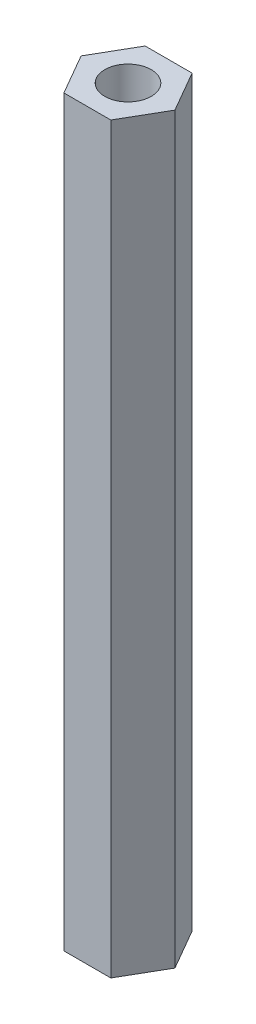
ISO-10303-21;
HEADER;
FILE_DESCRIPTION(('STEP AP214'),'2;1');
FILE_NAME('part.step','',(''),(''),'','','');
FILE_SCHEMA(('AUTOMOTIVE_DESIGN { 1 0 10303 214 1 1 1 1 }'));
ENDSEC;
DATA;
#1=APPLICATION_CONTEXT('core data for automotive mechanical design processes');
#2=APPLICATION_PROTOCOL_DEFINITION('international standard','automotive_design',2000,#1);
#3=PRODUCT_CONTEXT('',#1,'mechanical');
#4=PRODUCT('Part','Part','',(#3));
#5=PRODUCT_RELATED_PRODUCT_CATEGORY('part','',(#4));
#6=PRODUCT_DEFINITION_FORMATION('','',#4);
#7=PRODUCT_DEFINITION_CONTEXT('part definition',#1,'design');
#8=PRODUCT_DEFINITION('design','',#6,#7);
#9=PRODUCT_DEFINITION_SHAPE('','',#8);
#10=(LENGTH_UNIT() NAMED_UNIT(*) SI_UNIT(.MILLI.,.METRE.));
#11=(NAMED_UNIT(*) PLANE_ANGLE_UNIT() SI_UNIT($,.RADIAN.));
#12=(NAMED_UNIT(*) SI_UNIT($,.STERADIAN.) SOLID_ANGLE_UNIT());
#13=UNCERTAINTY_MEASURE_WITH_UNIT(LENGTH_MEASURE(1.E-05),#10,'distance_accuracy_value','');
#14=(GEOMETRIC_REPRESENTATION_CONTEXT(3) GLOBAL_UNCERTAINTY_ASSIGNED_CONTEXT((#13)) GLOBAL_UNIT_ASSIGNED_CONTEXT((#10,
#11,#12)) REPRESENTATION_CONTEXT('',''));
#15=CARTESIAN_POINT('',(0.,0.,0.));
#16=DIRECTION('',(0.,0.,1.));
#17=DIRECTION('',(1.,0.,0.));
#18=AXIS2_PLACEMENT_3D('',#15,#16,#17);
#19=CARTESIAN_POINT('',(0.,64.,0.));
#20=DIRECTION('',(0.,1.,0.));
#21=DIRECTION('',(0.,0.,1.));
#22=AXIS2_PLACEMENT_3D('',#19,#20,#21);
#23=PLANE('',#22);
#24=DIRECTION('',(-0.5,0.,-0.866025403784438));
#25=VECTOR('',#24,1.);
#26=CARTESIAN_POINT('',(4.04145188432738,64.,0.));
#27=LINE('',#26,#25);
#28=CARTESIAN_POINT('',(4.04145188432738,64.,0.));
#29=VERTEX_POINT('',#28);
#30=CARTESIAN_POINT('',(2.02072594216369,64.,-3.5));
#31=VERTEX_POINT('',#30);
#32=EDGE_CURVE('E139',#29,#31,#27,.T.);
#33=ORIENTED_EDGE('',*,*,#32,.T.);
#34=DIRECTION('',(-1.,0.,0.));
#35=VECTOR('',#34,1.);
#36=CARTESIAN_POINT('',(2.02072594216369,64.,-3.5));
#37=LINE('',#36,#35);
#38=CARTESIAN_POINT('',(-2.02072594216369,64.,-3.5));
#39=VERTEX_POINT('',#38);
#40=EDGE_CURVE('E97',#31,#39,#37,.T.);
#41=ORIENTED_EDGE('',*,*,#40,.T.);
#42=DIRECTION('',(-0.5,0.,0.866025403784439));
#43=VECTOR('',#42,1.);
#44=CARTESIAN_POINT('',(-2.02072594216369,64.,-3.5));
#45=LINE('',#44,#43);
#46=CARTESIAN_POINT('',(-4.04145188432738,64.,0.));
#47=VERTEX_POINT('',#46);
#48=EDGE_CURVE('E110',#39,#47,#45,.T.);
#49=ORIENTED_EDGE('',*,*,#48,.T.);
#50=DIRECTION('',(0.5,0.,0.866025403784438));
#51=VECTOR('',#50,1.);
#52=CARTESIAN_POINT('',(-4.04145188432738,64.,0.));
#53=LINE('',#52,#51);
#54=CARTESIAN_POINT('',(-2.02072594216369,64.,3.5));
#55=VERTEX_POINT('',#54);
#56=EDGE_CURVE('E104',#47,#55,#53,.T.);
#57=ORIENTED_EDGE('',*,*,#56,.T.);
#58=DIRECTION('',(1.,0.,0.));
#59=VECTOR('',#58,1.);
#60=CARTESIAN_POINT('',(-2.02072594216369,64.,3.5));
#61=LINE('',#60,#59);
#62=CARTESIAN_POINT('',(2.02072594216369,64.,3.5));
#63=VERTEX_POINT('',#62);
#64=EDGE_CURVE('E108',#55,#63,#61,.T.);
#65=ORIENTED_EDGE('',*,*,#64,.T.);
#66=DIRECTION('',(0.5,0.,-0.866025403784439));
#67=VECTOR('',#66,1.);
#68=CARTESIAN_POINT('',(2.02072594216369,64.,3.5));
#69=LINE('',#68,#67);
#70=EDGE_CURVE('E60',#63,#29,#69,.T.);
#71=ORIENTED_EDGE('',*,*,#70,.T.);
#72=EDGE_LOOP('',(#33,#41,#49,#57,#65,#71));
#73=FACE_BOUND('',#72,.T.);
#74=CARTESIAN_POINT('',(0.,64.,0.));
#75=DIRECTION('',(0.,1.,0.));
#76=DIRECTION('',(0.,0.,1.));
#77=AXIS2_PLACEMENT_3D('',#74,#75,#76);
#78=CIRCLE('',#77,2.);
#79=CARTESIAN_POINT('',(0.,64.,2.));
#80=VERTEX_POINT('',#79);
#81=EDGE_CURVE('E132',#80,#80,#78,.T.);
#82=ORIENTED_EDGE('',*,*,#81,.F.);
#83=EDGE_LOOP('',(#82));
#84=FACE_BOUND('',#83,.T.);
#85=ADVANCED_FACE('F43',(#73,#84),#23,.T.);
#86=CARTESIAN_POINT('',(0.,0.,0.));
#87=DIRECTION('',(0.,1.,0.));
#88=DIRECTION('',(0.,0.,1.));
#89=AXIS2_PLACEMENT_3D('',#86,#87,#88);
#90=PLANE('',#89);
#91=DIRECTION('',(-0.5,0.,-0.866025403784438));
#92=VECTOR('',#91,1.);
#93=CARTESIAN_POINT('',(4.04145188432738,0.,0.));
#94=LINE('',#93,#92);
#95=CARTESIAN_POINT('',(4.04145188432738,0.,0.));
#96=VERTEX_POINT('',#95);
#97=CARTESIAN_POINT('',(2.02072594216369,0.,-3.5));
#98=VERTEX_POINT('',#97);
#99=EDGE_CURVE('E128',#96,#98,#94,.T.);
#100=ORIENTED_EDGE('',*,*,#99,.F.);
#101=DIRECTION('',(0.5,0.,-0.866025403784439));
#102=VECTOR('',#101,1.);
#103=CARTESIAN_POINT('',(2.02072594216369,0.,3.5));
#104=LINE('',#103,#102);
#105=CARTESIAN_POINT('',(2.02072594216369,0.,3.5));
#106=VERTEX_POINT('',#105);
#107=EDGE_CURVE('E89',#106,#96,#104,.T.);
#108=ORIENTED_EDGE('',*,*,#107,.F.);
#109=DIRECTION('',(1.,0.,0.));
#110=VECTOR('',#109,1.);
#111=CARTESIAN_POINT('',(-2.02072594216369,0.,3.5));
#112=LINE('',#111,#110);
#113=CARTESIAN_POINT('',(-2.02072594216369,0.,3.5));
#114=VERTEX_POINT('',#113);
#115=EDGE_CURVE('E83',#114,#106,#112,.T.);
#116=ORIENTED_EDGE('',*,*,#115,.F.);
#117=DIRECTION('',(0.5,0.,0.866025403784438));
#118=VECTOR('',#117,1.);
#119=CARTESIAN_POINT('',(-4.04145188432738,0.,0.));
#120=LINE('',#119,#118);
#121=CARTESIAN_POINT('',(-4.04145188432738,0.,0.));
#122=VERTEX_POINT('',#121);
#123=EDGE_CURVE('E118',#122,#114,#120,.T.);
#124=ORIENTED_EDGE('',*,*,#123,.F.);
#125=DIRECTION('',(-0.5,0.,0.866025403784439));
#126=VECTOR('',#125,1.);
#127=CARTESIAN_POINT('',(-2.02072594216369,0.,-3.5));
#128=LINE('',#127,#126);
#129=CARTESIAN_POINT('',(-2.02072594216369,0.,-3.5));
#130=VERTEX_POINT('',#129);
#131=EDGE_CURVE('E134',#130,#122,#128,.T.);
#132=ORIENTED_EDGE('',*,*,#131,.F.);
#133=DIRECTION('',(-1.,0.,0.));
#134=VECTOR('',#133,1.);
#135=CARTESIAN_POINT('',(2.02072594216369,0.,-3.5));
#136=LINE('',#135,#134);
#137=EDGE_CURVE('E131',#98,#130,#136,.T.);
#138=ORIENTED_EDGE('',*,*,#137,.F.);
#139=EDGE_LOOP('',(#100,#108,#116,#124,#132,#138));
#140=FACE_BOUND('',#139,.T.);
#141=CARTESIAN_POINT('',(0.,0.,0.));
#142=DIRECTION('',(0.,1.,0.));
#143=DIRECTION('',(0.,0.,1.));
#144=AXIS2_PLACEMENT_3D('',#141,#142,#143);
#145=CIRCLE('',#144,2.);
#146=CARTESIAN_POINT('',(0.,0.,2.));
#147=VERTEX_POINT('',#146);
#148=EDGE_CURVE('E240',#147,#147,#145,.T.);
#149=ORIENTED_EDGE('',*,*,#148,.T.);
#150=EDGE_LOOP('',(#149));
#151=FACE_BOUND('',#150,.T.);
#152=ADVANCED_FACE('F148',(#140,#151),#90,.F.);
#153=CARTESIAN_POINT('',(4.04145188432738,64.,0.));
#154=DIRECTION('',(-0.866025403784439,0.,0.5));
#155=DIRECTION('',(0.5,0.,0.866025403784439));
#156=AXIS2_PLACEMENT_3D('',#153,#154,#155);
#157=PLANE('',#156);
#158=ORIENTED_EDGE('',*,*,#99,.T.);
#159=DIRECTION('',(0.,-1.,0.));
#160=VECTOR('',#159,1.);
#161=CARTESIAN_POINT('',(2.02072594216369,64.,-3.5));
#162=LINE('',#161,#160);
#163=EDGE_CURVE('E11',#31,#98,#162,.T.);
#164=ORIENTED_EDGE('',*,*,#163,.F.);
#165=ORIENTED_EDGE('',*,*,#32,.F.);
#166=DIRECTION('',(0.,-1.,0.));
#167=VECTOR('',#166,1.);
#168=CARTESIAN_POINT('',(4.04145188432738,64.,0.));
#169=LINE('',#168,#167);
#170=EDGE_CURVE('E124',#29,#96,#169,.T.);
#171=ORIENTED_EDGE('',*,*,#170,.T.);
#172=EDGE_LOOP('',(#158,#164,#165,#171));
#173=FACE_BOUND('',#172,.T.);
#174=ADVANCED_FACE('F45',(#173),#157,.F.);
#175=CARTESIAN_POINT('',(2.02072594216369,64.,-3.5));
#176=DIRECTION('',(0.,0.,1.));
#177=DIRECTION('',(1.,0.,0.));
#178=AXIS2_PLACEMENT_3D('',#175,#176,#177);
#179=PLANE('',#178);
#180=ORIENTED_EDGE('',*,*,#137,.T.);
#181=DIRECTION('',(0.,-1.,0.));
#182=VECTOR('',#181,1.);
#183=CARTESIAN_POINT('',(-2.02072594216369,64.,-3.5));
#184=LINE('',#183,#182);
#185=EDGE_CURVE('E52',#39,#130,#184,.T.);
#186=ORIENTED_EDGE('',*,*,#185,.F.);
#187=ORIENTED_EDGE('',*,*,#40,.F.);
#188=ORIENTED_EDGE('',*,*,#163,.T.);
#189=EDGE_LOOP('',(#180,#186,#187,#188));
#190=FACE_BOUND('',#189,.T.);
#191=ADVANCED_FACE('F174',(#190),#179,.F.);
#192=CARTESIAN_POINT('',(-2.02072594216369,64.,-3.5));
#193=DIRECTION('',(0.866025403784439,0.,0.5));
#194=DIRECTION('',(0.5,0.,-0.866025403784439));
#195=AXIS2_PLACEMENT_3D('',#192,#193,#194);
#196=PLANE('',#195);
#197=ORIENTED_EDGE('',*,*,#131,.T.);
#198=DIRECTION('',(0.,-1.,0.));
#199=VECTOR('',#198,1.);
#200=CARTESIAN_POINT('',(-4.04145188432738,64.,0.));
#201=LINE('',#200,#199);
#202=EDGE_CURVE('E119',#47,#122,#201,.T.);
#203=ORIENTED_EDGE('',*,*,#202,.F.);
#204=ORIENTED_EDGE('',*,*,#48,.F.);
#205=ORIENTED_EDGE('',*,*,#185,.T.);
#206=EDGE_LOOP('',(#197,#203,#204,#205));
#207=FACE_BOUND('',#206,.T.);
#208=ADVANCED_FACE('F145',(#207),#196,.F.);
#209=CARTESIAN_POINT('',(-4.04145188432738,64.,0.));
#210=DIRECTION('',(0.866025403784438,0.,-0.5));
#211=DIRECTION('',(-0.5,0.,-0.866025403784438));
#212=AXIS2_PLACEMENT_3D('',#209,#210,#211);
#213=PLANE('',#212);
#214=ORIENTED_EDGE('',*,*,#123,.T.);
#215=DIRECTION('',(0.,-1.,0.));
#216=VECTOR('',#215,1.);
#217=CARTESIAN_POINT('',(-2.02072594216369,64.,3.5));
#218=LINE('',#217,#216);
#219=EDGE_CURVE('E115',#55,#114,#218,.T.);
#220=ORIENTED_EDGE('',*,*,#219,.F.);
#221=ORIENTED_EDGE('',*,*,#56,.F.);
#222=ORIENTED_EDGE('',*,*,#202,.T.);
#223=EDGE_LOOP('',(#214,#220,#221,#222));
#224=FACE_BOUND('',#223,.T.);
#225=ADVANCED_FACE('F116',(#224),#213,.F.);
#226=CARTESIAN_POINT('',(-2.02072594216369,64.,3.5));
#227=DIRECTION('',(0.,0.,-1.));
#228=DIRECTION('',(-1.,0.,0.));
#229=AXIS2_PLACEMENT_3D('',#226,#227,#228);
#230=PLANE('',#229);
#231=ORIENTED_EDGE('',*,*,#115,.T.);
#232=DIRECTION('',(0.,-1.,0.));
#233=VECTOR('',#232,1.);
#234=CARTESIAN_POINT('',(2.02072594216369,64.,3.5));
#235=LINE('',#234,#233);
#236=EDGE_CURVE('E120',#63,#106,#235,.T.);
#237=ORIENTED_EDGE('',*,*,#236,.F.);
#238=ORIENTED_EDGE('',*,*,#64,.F.);
#239=ORIENTED_EDGE('',*,*,#219,.T.);
#240=EDGE_LOOP('',(#231,#237,#238,#239));
#241=FACE_BOUND('',#240,.T.);
#242=ADVANCED_FACE('F122',(#241),#230,.F.);
#243=CARTESIAN_POINT('',(2.02072594216369,64.,3.5));
#244=DIRECTION('',(-0.866025403784439,0.,-0.5));
#245=DIRECTION('',(-0.5,0.,0.866025403784439));
#246=AXIS2_PLACEMENT_3D('',#243,#244,#245);
#247=PLANE('',#246);
#248=ORIENTED_EDGE('',*,*,#107,.T.);
#249=ORIENTED_EDGE('',*,*,#170,.F.);
#250=ORIENTED_EDGE('',*,*,#70,.F.);
#251=ORIENTED_EDGE('',*,*,#236,.T.);
#252=EDGE_LOOP('',(#248,#249,#250,#251));
#253=FACE_BOUND('',#252,.T.);
#254=ADVANCED_FACE('F153',(#253),#247,.F.);
#255=CARTESIAN_POINT('',(0.,64.,0.));
#256=DIRECTION('',(0.,-1.,0.));
#257=DIRECTION('',(0.,0.,-1.));
#258=AXIS2_PLACEMENT_3D('',#255,#256,#257);
#259=CYLINDRICAL_SURFACE('',#258,2.);
#260=ORIENTED_EDGE('',*,*,#81,.T.);
#261=EDGE_LOOP('',(#260));
#262=FACE_BOUND('',#261,.T.);
#263=ORIENTED_EDGE('',*,*,#148,.F.);
#264=EDGE_LOOP('',(#263));
#265=FACE_BOUND('',#264,.T.);
#266=ADVANCED_FACE('F155',(#262,#265),#259,.F.);
#267=CLOSED_SHELL('',(#85,#152,#174,#191,#208,#225,#242,#254,#266));
#268=MANIFOLD_SOLID_BREP('B2',#267);
#269=ADVANCED_BREP_SHAPE_REPRESENTATION('',(#18,#268),#14);
#270=SHAPE_DEFINITION_REPRESENTATION(#9,#269);
ENDSEC;
END-ISO-10303-21;
